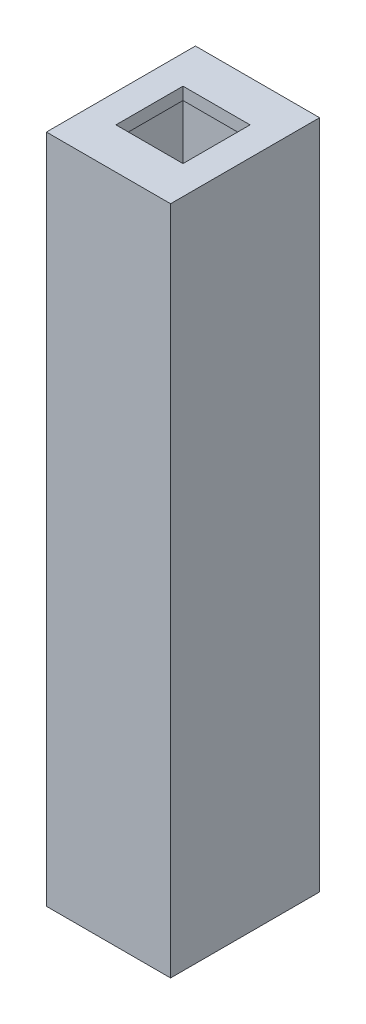
ISO-10303-21;
HEADER;
FILE_DESCRIPTION(('STEP AP214'),'2;1');
FILE_NAME('part.step','',(''),(''),'','','');
FILE_SCHEMA(('AUTOMOTIVE_DESIGN { 1 0 10303 214 1 1 1 1 }'));
ENDSEC;
DATA;
#1=APPLICATION_CONTEXT('core data for automotive mechanical design processes');
#2=APPLICATION_PROTOCOL_DEFINITION('international standard','automotive_design',2000,#1);
#3=PRODUCT_CONTEXT('',#1,'mechanical');
#4=PRODUCT('Part','Part','',(#3));
#5=PRODUCT_RELATED_PRODUCT_CATEGORY('part','',(#4));
#6=PRODUCT_DEFINITION_FORMATION('','',#4);
#7=PRODUCT_DEFINITION_CONTEXT('part definition',#1,'design');
#8=PRODUCT_DEFINITION('design','',#6,#7);
#9=PRODUCT_DEFINITION_SHAPE('','',#8);
#10=(LENGTH_UNIT() NAMED_UNIT(*) SI_UNIT(.MILLI.,.METRE.));
#11=(NAMED_UNIT(*) PLANE_ANGLE_UNIT() SI_UNIT($,.RADIAN.));
#12=(NAMED_UNIT(*) SI_UNIT($,.STERADIAN.) SOLID_ANGLE_UNIT());
#13=UNCERTAINTY_MEASURE_WITH_UNIT(LENGTH_MEASURE(1.E-05),#10,'distance_accuracy_value','');
#14=(GEOMETRIC_REPRESENTATION_CONTEXT(3) GLOBAL_UNCERTAINTY_ASSIGNED_CONTEXT((#13)) GLOBAL_UNIT_ASSIGNED_CONTEXT((#10,
#11,#12)) REPRESENTATION_CONTEXT('',''));
#15=CARTESIAN_POINT('',(0.,0.,0.));
#16=DIRECTION('',(0.,0.,1.));
#17=DIRECTION('',(1.,0.,0.));
#18=AXIS2_PLACEMENT_3D('',#15,#16,#17);
#19=CARTESIAN_POINT('',(0.,54.,-3.1));
#20=DIRECTION('',(0.,0.,-1.));
#21=DIRECTION('',(-1.,0.,0.));
#22=AXIS2_PLACEMENT_3D('',#19,#20,#21);
#23=PLANE('',#22);
#24=DIRECTION('',(0.,-1.,0.));
#25=VECTOR('',#24,1.);
#26=CARTESIAN_POINT('',(3.1,54.,-3.1));
#27=LINE('',#26,#25);
#28=CARTESIAN_POINT('',(3.1,53.,-3.1));
#29=VERTEX_POINT('',#28);
#30=CARTESIAN_POINT('',(3.1,0.,-3.1));
#31=VERTEX_POINT('',#30);
#32=EDGE_CURVE('E72',#29,#31,#27,.T.);
#33=ORIENTED_EDGE('',*,*,#32,.F.);
#34=DIRECTION('',(-1.,0.,0.));
#35=VECTOR('',#34,1.);
#36=CARTESIAN_POINT('',(0.,53.,-3.1));
#37=LINE('',#36,#35);
#38=CARTESIAN_POINT('',(-3.1,53.,-3.1));
#39=VERTEX_POINT('',#38);
#40=EDGE_CURVE('E202',#29,#39,#37,.T.);
#41=ORIENTED_EDGE('',*,*,#40,.T.);
#42=DIRECTION('',(0.,-1.,0.));
#43=VECTOR('',#42,1.);
#44=CARTESIAN_POINT('',(-3.1,54.,-3.1));
#45=LINE('',#44,#43);
#46=CARTESIAN_POINT('',(-3.1,0.,-3.1));
#47=VERTEX_POINT('',#46);
#48=EDGE_CURVE('E240',#39,#47,#45,.T.);
#49=ORIENTED_EDGE('',*,*,#48,.T.);
#50=DIRECTION('',(1.,0.,0.));
#51=VECTOR('',#50,1.);
#52=CARTESIAN_POINT('',(0.,0.,-3.1));
#53=LINE('',#52,#51);
#54=EDGE_CURVE('E229',#47,#31,#53,.T.);
#55=ORIENTED_EDGE('',*,*,#54,.T.);
#56=EDGE_LOOP('',(#33,#41,#49,#55));
#57=FACE_BOUND('',#56,.T.);
#58=ADVANCED_FACE('F64',(#57),#23,.F.);
#59=CARTESIAN_POINT('',(3.1,54.,0.));
#60=DIRECTION('',(1.,0.,0.));
#61=DIRECTION('',(0.,0.,-1.));
#62=AXIS2_PLACEMENT_3D('',#59,#60,#61);
#63=PLANE('',#62);
#64=DIRECTION('',(0.,-1.,0.));
#65=VECTOR('',#64,1.);
#66=CARTESIAN_POINT('',(3.1,54.,3.1));
#67=LINE('',#66,#65);
#68=CARTESIAN_POINT('',(3.1,53.,3.1));
#69=VERTEX_POINT('',#68);
#70=CARTESIAN_POINT('',(3.1,0.,3.1));
#71=VERTEX_POINT('',#70);
#72=EDGE_CURVE('E245',#69,#71,#67,.T.);
#73=ORIENTED_EDGE('',*,*,#72,.F.);
#74=DIRECTION('',(0.,0.,-1.));
#75=VECTOR('',#74,1.);
#76=CARTESIAN_POINT('',(3.1,53.,0.));
#77=LINE('',#76,#75);
#78=EDGE_CURVE('E79',#69,#29,#77,.T.);
#79=ORIENTED_EDGE('',*,*,#78,.T.);
#80=ORIENTED_EDGE('',*,*,#32,.T.);
#81=DIRECTION('',(0.,0.,1.));
#82=VECTOR('',#81,1.);
#83=CARTESIAN_POINT('',(3.1,0.,0.));
#84=LINE('',#83,#82);
#85=EDGE_CURVE('E232',#31,#71,#84,.T.);
#86=ORIENTED_EDGE('',*,*,#85,.T.);
#87=EDGE_LOOP('',(#73,#79,#80,#86));
#88=FACE_BOUND('',#87,.T.);
#89=ADVANCED_FACE('F287',(#88),#63,.F.);
#90=CARTESIAN_POINT('',(0.,54.,3.1));
#91=DIRECTION('',(0.,0.,-1.));
#92=DIRECTION('',(-1.,0.,0.));
#93=AXIS2_PLACEMENT_3D('',#90,#91,#92);
#94=PLANE('',#93);
#95=DIRECTION('',(-1.,0.,0.));
#96=VECTOR('',#95,1.);
#97=CARTESIAN_POINT('',(0.,53.,3.1));
#98=LINE('',#97,#96);
#99=CARTESIAN_POINT('',(-3.1,53.,3.1));
#100=VERTEX_POINT('',#99);
#101=EDGE_CURVE('E87',#69,#100,#98,.T.);
#102=ORIENTED_EDGE('',*,*,#101,.F.);
#103=ORIENTED_EDGE('',*,*,#72,.T.);
#104=DIRECTION('',(1.,0.,0.));
#105=VECTOR('',#104,1.);
#106=CARTESIAN_POINT('',(0.,0.,3.1));
#107=LINE('',#106,#105);
#108=CARTESIAN_POINT('',(-3.1,0.,3.1));
#109=VERTEX_POINT('',#108);
#110=EDGE_CURVE('E235',#109,#71,#107,.T.);
#111=ORIENTED_EDGE('',*,*,#110,.F.);
#112=DIRECTION('',(0.,-1.,0.));
#113=VECTOR('',#112,1.);
#114=CARTESIAN_POINT('',(-3.1,54.,3.1));
#115=LINE('',#114,#113);
#116=EDGE_CURVE('E242',#100,#109,#115,.T.);
#117=ORIENTED_EDGE('',*,*,#116,.F.);
#118=EDGE_LOOP('',(#102,#103,#111,#117));
#119=FACE_BOUND('',#118,.T.);
#120=ADVANCED_FACE('F292',(#119),#94,.T.);
#121=CARTESIAN_POINT('',(5.,54.,0.));
#122=DIRECTION('',(1.,0.,0.));
#123=DIRECTION('',(0.,0.,-1.));
#124=AXIS2_PLACEMENT_3D('',#121,#122,#123);
#125=PLANE('',#124);
#126=DIRECTION('',(0.,0.,1.));
#127=VECTOR('',#126,1.);
#128=CARTESIAN_POINT('',(5.,0.,0.));
#129=LINE('',#128,#127);
#130=CARTESIAN_POINT('',(5.,0.,-6.));
#131=VERTEX_POINT('',#130);
#132=CARTESIAN_POINT('',(5.,0.,6.));
#133=VERTEX_POINT('',#132);
#134=EDGE_CURVE('E205',#131,#133,#129,.T.);
#135=ORIENTED_EDGE('',*,*,#134,.F.);
#136=DIRECTION('',(0.,-1.,0.));
#137=VECTOR('',#136,1.);
#138=CARTESIAN_POINT('',(5.,54.,-6.));
#139=LINE('',#138,#137);
#140=CARTESIAN_POINT('',(5.,54.,-6.));
#141=VERTEX_POINT('',#140);
#142=EDGE_CURVE('E243',#141,#131,#139,.T.);
#143=ORIENTED_EDGE('',*,*,#142,.F.);
#144=DIRECTION('',(0.,0.,1.));
#145=VECTOR('',#144,1.);
#146=CARTESIAN_POINT('',(5.,54.,0.));
#147=LINE('',#146,#145);
#148=CARTESIAN_POINT('',(5.,54.,6.));
#149=VERTEX_POINT('',#148);
#150=EDGE_CURVE('E206',#141,#149,#147,.T.);
#151=ORIENTED_EDGE('',*,*,#150,.T.);
#152=DIRECTION('',(0.,-1.,0.));
#153=VECTOR('',#152,1.);
#154=CARTESIAN_POINT('',(5.,54.,6.));
#155=LINE('',#154,#153);
#156=EDGE_CURVE('E217',#149,#133,#155,.T.);
#157=ORIENTED_EDGE('',*,*,#156,.T.);
#158=EDGE_LOOP('',(#135,#143,#151,#157));
#159=FACE_BOUND('',#158,.T.);
#160=ADVANCED_FACE('F66',(#159),#125,.T.);
#161=CARTESIAN_POINT('',(0.,54.,-6.));
#162=DIRECTION('',(0.,0.,-1.));
#163=DIRECTION('',(-1.,0.,0.));
#164=AXIS2_PLACEMENT_3D('',#161,#162,#163);
#165=PLANE('',#164);
#166=DIRECTION('',(1.,0.,0.));
#167=VECTOR('',#166,1.);
#168=CARTESIAN_POINT('',(0.,0.,-6.));
#169=LINE('',#168,#167);
#170=CARTESIAN_POINT('',(-5.,0.,-6.));
#171=VERTEX_POINT('',#170);
#172=EDGE_CURVE('E220',#171,#131,#169,.T.);
#173=ORIENTED_EDGE('',*,*,#172,.F.);
#174=DIRECTION('',(0.,-1.,0.));
#175=VECTOR('',#174,1.);
#176=CARTESIAN_POINT('',(-5.,54.,-6.));
#177=LINE('',#176,#175);
#178=CARTESIAN_POINT('',(-5.,54.,-6.));
#179=VERTEX_POINT('',#178);
#180=EDGE_CURVE('E251',#179,#171,#177,.T.);
#181=ORIENTED_EDGE('',*,*,#180,.F.);
#182=DIRECTION('',(1.,0.,0.));
#183=VECTOR('',#182,1.);
#184=CARTESIAN_POINT('',(0.,54.,-6.));
#185=LINE('',#184,#183);
#186=EDGE_CURVE('E209',#179,#141,#185,.T.);
#187=ORIENTED_EDGE('',*,*,#186,.T.);
#188=ORIENTED_EDGE('',*,*,#142,.T.);
#189=EDGE_LOOP('',(#173,#181,#187,#188));
#190=FACE_BOUND('',#189,.T.);
#191=ADVANCED_FACE('F255',(#190),#165,.T.);
#192=CARTESIAN_POINT('',(-5.,54.,0.));
#193=DIRECTION('',(1.,0.,0.));
#194=DIRECTION('',(0.,0.,-1.));
#195=AXIS2_PLACEMENT_3D('',#192,#193,#194);
#196=PLANE('',#195);
#197=DIRECTION('',(0.,0.,1.));
#198=VECTOR('',#197,1.);
#199=CARTESIAN_POINT('',(-5.,0.,0.));
#200=LINE('',#199,#198);
#201=CARTESIAN_POINT('',(-5.,0.,6.));
#202=VERTEX_POINT('',#201);
#203=EDGE_CURVE('E223',#171,#202,#200,.T.);
#204=ORIENTED_EDGE('',*,*,#203,.T.);
#205=DIRECTION('',(0.,-1.,0.));
#206=VECTOR('',#205,1.);
#207=CARTESIAN_POINT('',(-5.,54.,6.));
#208=LINE('',#207,#206);
#209=CARTESIAN_POINT('',(-5.,54.,6.));
#210=VERTEX_POINT('',#209);
#211=EDGE_CURVE('E249',#210,#202,#208,.T.);
#212=ORIENTED_EDGE('',*,*,#211,.F.);
#213=DIRECTION('',(0.,0.,1.));
#214=VECTOR('',#213,1.);
#215=CARTESIAN_POINT('',(-5.,54.,0.));
#216=LINE('',#215,#214);
#217=EDGE_CURVE('E213',#179,#210,#216,.T.);
#218=ORIENTED_EDGE('',*,*,#217,.F.);
#219=ORIENTED_EDGE('',*,*,#180,.T.);
#220=EDGE_LOOP('',(#204,#212,#218,#219));
#221=FACE_BOUND('',#220,.T.);
#222=ADVANCED_FACE('F267',(#221),#196,.F.);
#223=CARTESIAN_POINT('',(0.,54.,6.));
#224=DIRECTION('',(0.,0.,-1.));
#225=DIRECTION('',(-1.,0.,0.));
#226=AXIS2_PLACEMENT_3D('',#223,#224,#225);
#227=PLANE('',#226);
#228=DIRECTION('',(1.,0.,0.));
#229=VECTOR('',#228,1.);
#230=CARTESIAN_POINT('',(0.,0.,6.));
#231=LINE('',#230,#229);
#232=EDGE_CURVE('E226',#202,#133,#231,.T.);
#233=ORIENTED_EDGE('',*,*,#232,.T.);
#234=ORIENTED_EDGE('',*,*,#156,.F.);
#235=DIRECTION('',(1.,0.,0.));
#236=VECTOR('',#235,1.);
#237=CARTESIAN_POINT('',(0.,54.,6.));
#238=LINE('',#237,#236);
#239=EDGE_CURVE('E215',#210,#149,#238,.T.);
#240=ORIENTED_EDGE('',*,*,#239,.F.);
#241=ORIENTED_EDGE('',*,*,#211,.T.);
#242=EDGE_LOOP('',(#233,#234,#240,#241));
#243=FACE_BOUND('',#242,.T.);
#244=ADVANCED_FACE('F274',(#243),#227,.F.);
#245=CARTESIAN_POINT('',(-3.1,54.,0.));
#246=DIRECTION('',(1.,0.,0.));
#247=DIRECTION('',(0.,0.,-1.));
#248=AXIS2_PLACEMENT_3D('',#245,#246,#247);
#249=PLANE('',#248);
#250=DIRECTION('',(0.,0.,-1.));
#251=VECTOR('',#250,1.);
#252=CARTESIAN_POINT('',(-3.1,53.,0.));
#253=LINE('',#252,#251);
#254=EDGE_CURVE('E12',#100,#39,#253,.T.);
#255=ORIENTED_EDGE('',*,*,#254,.F.);
#256=ORIENTED_EDGE('',*,*,#116,.T.);
#257=DIRECTION('',(0.,0.,1.));
#258=VECTOR('',#257,1.);
#259=CARTESIAN_POINT('',(-3.1,0.,0.));
#260=LINE('',#259,#258);
#261=EDGE_CURVE('E210',#47,#109,#260,.T.);
#262=ORIENTED_EDGE('',*,*,#261,.F.);
#263=ORIENTED_EDGE('',*,*,#48,.F.);
#264=EDGE_LOOP('',(#255,#256,#262,#263));
#265=FACE_BOUND('',#264,.T.);
#266=ADVANCED_FACE('F276',(#265),#249,.T.);
#267=CARTESIAN_POINT('',(0.,54.,0.));
#268=DIRECTION('',(0.,1.,0.));
#269=DIRECTION('',(0.,0.,1.));
#270=AXIS2_PLACEMENT_3D('',#267,#268,#269);
#271=PLANE('',#270);
#272=ORIENTED_EDGE('',*,*,#150,.F.);
#273=ORIENTED_EDGE('',*,*,#186,.F.);
#274=ORIENTED_EDGE('',*,*,#217,.T.);
#275=ORIENTED_EDGE('',*,*,#239,.T.);
#276=EDGE_LOOP('',(#272,#273,#274,#275));
#277=FACE_BOUND('',#276,.T.);
#278=DIRECTION('',(0.,0.,1.));
#279=VECTOR('',#278,1.);
#280=CARTESIAN_POINT('',(-2.7,54.,0.));
#281=LINE('',#280,#279);
#282=CARTESIAN_POINT('',(-2.7,54.,-2.7));
#283=VERTEX_POINT('',#282);
#284=CARTESIAN_POINT('',(-2.7,54.,2.7));
#285=VERTEX_POINT('',#284);
#286=EDGE_CURVE('E190',#283,#285,#281,.T.);
#287=ORIENTED_EDGE('',*,*,#286,.F.);
#288=DIRECTION('',(-1.,0.,0.));
#289=VECTOR('',#288,1.);
#290=CARTESIAN_POINT('',(0.,54.,-2.7));
#291=LINE('',#290,#289);
#292=CARTESIAN_POINT('',(2.7,54.,-2.7));
#293=VERTEX_POINT('',#292);
#294=EDGE_CURVE('E161',#293,#283,#291,.T.);
#295=ORIENTED_EDGE('',*,*,#294,.F.);
#296=DIRECTION('',(0.,0.,1.));
#297=VECTOR('',#296,1.);
#298=CARTESIAN_POINT('',(2.7,54.,0.));
#299=LINE('',#298,#297);
#300=CARTESIAN_POINT('',(2.7,54.,2.7));
#301=VERTEX_POINT('',#300);
#302=EDGE_CURVE('E178',#293,#301,#299,.T.);
#303=ORIENTED_EDGE('',*,*,#302,.T.);
#304=DIRECTION('',(-1.,0.,0.));
#305=VECTOR('',#304,1.);
#306=CARTESIAN_POINT('',(0.,54.,2.7));
#307=LINE('',#306,#305);
#308=EDGE_CURVE('E181',#301,#285,#307,.T.);
#309=ORIENTED_EDGE('',*,*,#308,.T.);
#310=EDGE_LOOP('',(#287,#295,#303,#309));
#311=FACE_BOUND('',#310,.T.);
#312=ADVANCED_FACE('F271',(#277,#311),#271,.T.);
#313=CARTESIAN_POINT('',(0.,0.,0.));
#314=DIRECTION('',(0.,1.,0.));
#315=DIRECTION('',(0.,0.,1.));
#316=AXIS2_PLACEMENT_3D('',#313,#314,#315);
#317=PLANE('',#316);
#318=CARTESIAN_POINT('',(3.74999999999999,0.,4.5));
#319=DIRECTION('',(0.,-1.,0.));
#320=DIRECTION('',(0.,0.,-1.));
#321=AXIS2_PLACEMENT_3D('',#318,#319,#320);
#322=CIRCLE('',#321,0.3);
#323=CARTESIAN_POINT('',(3.74999999999999,0.,4.2));
#324=VERTEX_POINT('',#323);
#325=EDGE_CURVE('E364',#324,#324,#322,.T.);
#326=ORIENTED_EDGE('',*,*,#325,.F.);
#327=EDGE_LOOP('',(#326));
#328=FACE_BOUND('',#327,.T.);
#329=CARTESIAN_POINT('',(-3.75,0.,-4.5));
#330=DIRECTION('',(0.,-1.,0.));
#331=DIRECTION('',(0.,0.,-1.));
#332=AXIS2_PLACEMENT_3D('',#329,#330,#331);
#333=CIRCLE('',#332,0.3);
#334=CARTESIAN_POINT('',(-3.75,0.,-4.8));
#335=VERTEX_POINT('',#334);
#336=EDGE_CURVE('E360',#335,#335,#333,.T.);
#337=ORIENTED_EDGE('',*,*,#336,.F.);
#338=EDGE_LOOP('',(#337));
#339=FACE_BOUND('',#338,.T.);
#340=CARTESIAN_POINT('',(3.74999999999999,0.,-4.5));
#341=DIRECTION('',(0.,-1.,0.));
#342=DIRECTION('',(0.,0.,-1.));
#343=AXIS2_PLACEMENT_3D('',#340,#341,#342);
#344=CIRCLE('',#343,0.3);
#345=CARTESIAN_POINT('',(3.74999999999999,0.,-4.8));
#346=VERTEX_POINT('',#345);
#347=EDGE_CURVE('E355',#346,#346,#344,.T.);
#348=ORIENTED_EDGE('',*,*,#347,.F.);
#349=EDGE_LOOP('',(#348));
#350=FACE_BOUND('',#349,.T.);
#351=CARTESIAN_POINT('',(-3.75,0.,4.5));
#352=DIRECTION('',(0.,-1.,0.));
#353=DIRECTION('',(0.,0.,-1.));
#354=AXIS2_PLACEMENT_3D('',#351,#352,#353);
#355=CIRCLE('',#354,0.3);
#356=CARTESIAN_POINT('',(-3.75,0.,4.2));
#357=VERTEX_POINT('',#356);
#358=EDGE_CURVE('E184',#357,#357,#355,.T.);
#359=ORIENTED_EDGE('',*,*,#358,.F.);
#360=EDGE_LOOP('',(#359));
#361=FACE_BOUND('',#360,.T.);
#362=ORIENTED_EDGE('',*,*,#134,.T.);
#363=ORIENTED_EDGE('',*,*,#232,.F.);
#364=ORIENTED_EDGE('',*,*,#203,.F.);
#365=ORIENTED_EDGE('',*,*,#172,.T.);
#366=EDGE_LOOP('',(#362,#363,#364,#365));
#367=FACE_BOUND('',#366,.T.);
#368=ORIENTED_EDGE('',*,*,#54,.F.);
#369=ORIENTED_EDGE('',*,*,#261,.T.);
#370=ORIENTED_EDGE('',*,*,#110,.T.);
#371=ORIENTED_EDGE('',*,*,#85,.F.);
#372=EDGE_LOOP('',(#368,#369,#370,#371));
#373=FACE_BOUND('',#372,.T.);
#374=ADVANCED_FACE('F263',(#328,#339,#350,#361,#367,#373),#317,.F.);
#375=CARTESIAN_POINT('',(0.,53.,0.));
#376=DIRECTION('',(0.,-1.,0.));
#377=DIRECTION('',(0.,0.,-1.));
#378=AXIS2_PLACEMENT_3D('',#375,#376,#377);
#379=PLANE('',#378);
#380=DIRECTION('',(-1.,0.,0.));
#381=VECTOR('',#380,1.);
#382=CARTESIAN_POINT('',(0.,53.,-2.7));
#383=LINE('',#382,#381);
#384=CARTESIAN_POINT('',(2.7,53.,-2.7));
#385=VERTEX_POINT('',#384);
#386=CARTESIAN_POINT('',(-2.7,53.,-2.7));
#387=VERTEX_POINT('',#386);
#388=EDGE_CURVE('E158',#385,#387,#383,.T.);
#389=ORIENTED_EDGE('',*,*,#388,.T.);
#390=DIRECTION('',(0.,0.,1.));
#391=VECTOR('',#390,1.);
#392=CARTESIAN_POINT('',(-2.7,53.,0.));
#393=LINE('',#392,#391);
#394=CARTESIAN_POINT('',(-2.7,53.,2.7));
#395=VERTEX_POINT('',#394);
#396=EDGE_CURVE('E169',#387,#395,#393,.T.);
#397=ORIENTED_EDGE('',*,*,#396,.T.);
#398=DIRECTION('',(-1.,0.,0.));
#399=VECTOR('',#398,1.);
#400=CARTESIAN_POINT('',(0.,53.,2.7));
#401=LINE('',#400,#399);
#402=CARTESIAN_POINT('',(2.7,53.,2.7));
#403=VERTEX_POINT('',#402);
#404=EDGE_CURVE('E174',#403,#395,#401,.T.);
#405=ORIENTED_EDGE('',*,*,#404,.F.);
#406=DIRECTION('',(0.,0.,1.));
#407=VECTOR('',#406,1.);
#408=CARTESIAN_POINT('',(2.7,53.,0.));
#409=LINE('',#408,#407);
#410=EDGE_CURVE('E166',#385,#403,#409,.T.);
#411=ORIENTED_EDGE('',*,*,#410,.F.);
#412=EDGE_LOOP('',(#389,#397,#405,#411));
#413=FACE_BOUND('',#412,.T.);
#414=ORIENTED_EDGE('',*,*,#40,.F.);
#415=ORIENTED_EDGE('',*,*,#78,.F.);
#416=ORIENTED_EDGE('',*,*,#101,.T.);
#417=ORIENTED_EDGE('',*,*,#254,.T.);
#418=EDGE_LOOP('',(#414,#415,#416,#417));
#419=FACE_BOUND('',#418,.T.);
#420=ADVANCED_FACE('F176',(#413,#419),#379,.T.);
#421=CARTESIAN_POINT('',(0.,53.,-2.7));
#422=DIRECTION('',(0.,0.,-1.));
#423=DIRECTION('',(-1.,0.,0.));
#424=AXIS2_PLACEMENT_3D('',#421,#422,#423);
#425=PLANE('',#424);
#426=ORIENTED_EDGE('',*,*,#294,.T.);
#427=DIRECTION('',(0.,1.,0.));
#428=VECTOR('',#427,1.);
#429=CARTESIAN_POINT('',(-2.7,53.,-2.7));
#430=LINE('',#429,#428);
#431=EDGE_CURVE('E154',#387,#283,#430,.T.);
#432=ORIENTED_EDGE('',*,*,#431,.F.);
#433=ORIENTED_EDGE('',*,*,#388,.F.);
#434=DIRECTION('',(0.,1.,0.));
#435=VECTOR('',#434,1.);
#436=CARTESIAN_POINT('',(2.7,53.,-2.7));
#437=LINE('',#436,#435);
#438=EDGE_CURVE('E195',#385,#293,#437,.T.);
#439=ORIENTED_EDGE('',*,*,#438,.T.);
#440=EDGE_LOOP('',(#426,#432,#433,#439));
#441=FACE_BOUND('',#440,.T.);
#442=ADVANCED_FACE('F156',(#441),#425,.F.);
#443=CARTESIAN_POINT('',(2.7,53.,0.));
#444=DIRECTION('',(-1.,0.,0.));
#445=DIRECTION('',(0.,0.,1.));
#446=AXIS2_PLACEMENT_3D('',#443,#444,#445);
#447=PLANE('',#446);
#448=ORIENTED_EDGE('',*,*,#302,.F.);
#449=ORIENTED_EDGE('',*,*,#438,.F.);
#450=ORIENTED_EDGE('',*,*,#410,.T.);
#451=DIRECTION('',(0.,1.,0.));
#452=VECTOR('',#451,1.);
#453=CARTESIAN_POINT('',(2.7,53.,2.7));
#454=LINE('',#453,#452);
#455=EDGE_CURVE('E197',#403,#301,#454,.T.);
#456=ORIENTED_EDGE('',*,*,#455,.T.);
#457=EDGE_LOOP('',(#448,#449,#450,#456));
#458=FACE_BOUND('',#457,.T.);
#459=ADVANCED_FACE('F306',(#458),#447,.T.);
#460=CARTESIAN_POINT('',(0.,53.,2.7));
#461=DIRECTION('',(0.,0.,-1.));
#462=DIRECTION('',(-1.,0.,0.));
#463=AXIS2_PLACEMENT_3D('',#460,#461,#462);
#464=PLANE('',#463);
#465=ORIENTED_EDGE('',*,*,#308,.F.);
#466=ORIENTED_EDGE('',*,*,#455,.F.);
#467=ORIENTED_EDGE('',*,*,#404,.T.);
#468=DIRECTION('',(0.,1.,0.));
#469=VECTOR('',#468,1.);
#470=CARTESIAN_POINT('',(-2.7,53.,2.7));
#471=LINE('',#470,#469);
#472=EDGE_CURVE('E165',#395,#285,#471,.T.);
#473=ORIENTED_EDGE('',*,*,#472,.T.);
#474=EDGE_LOOP('',(#465,#466,#467,#473));
#475=FACE_BOUND('',#474,.T.);
#476=ADVANCED_FACE('F310',(#475),#464,.T.);
#477=CARTESIAN_POINT('',(-2.7,53.,0.));
#478=DIRECTION('',(-1.,0.,0.));
#479=DIRECTION('',(0.,0.,1.));
#480=AXIS2_PLACEMENT_3D('',#477,#478,#479);
#481=PLANE('',#480);
#482=ORIENTED_EDGE('',*,*,#286,.T.);
#483=ORIENTED_EDGE('',*,*,#472,.F.);
#484=ORIENTED_EDGE('',*,*,#396,.F.);
#485=ORIENTED_EDGE('',*,*,#431,.T.);
#486=EDGE_LOOP('',(#482,#483,#484,#485));
#487=FACE_BOUND('',#486,.T.);
#488=ADVANCED_FACE('F170',(#487),#481,.F.);
#489=CARTESIAN_POINT('',(-3.75,2.,4.5));
#490=DIRECTION('',(0.,-1.,0.));
#491=DIRECTION('',(0.,0.,-1.));
#492=AXIS2_PLACEMENT_3D('',#489,#490,#491);
#493=CYLINDRICAL_SURFACE('',#492,0.3);
#494=CARTESIAN_POINT('',(-3.75,2.,4.5));
#495=DIRECTION('',(0.,-1.,0.));
#496=DIRECTION('',(0.,0.,-1.));
#497=AXIS2_PLACEMENT_3D('',#494,#495,#496);
#498=CIRCLE('',#497,0.3);
#499=CARTESIAN_POINT('',(-3.75,2.,4.2));
#500=VERTEX_POINT('',#499);
#501=EDGE_CURVE('E191',#500,#500,#498,.T.);
#502=ORIENTED_EDGE('',*,*,#501,.F.);
#503=EDGE_LOOP('',(#502));
#504=FACE_BOUND('',#503,.T.);
#505=ORIENTED_EDGE('',*,*,#358,.T.);
#506=EDGE_LOOP('',(#505));
#507=FACE_BOUND('',#506,.T.);
#508=ADVANCED_FACE('F309',(#504,#507),#493,.F.);
#509=CARTESIAN_POINT('',(-3.75,2.,4.5));
#510=DIRECTION('',(0.,-1.,0.));
#511=DIRECTION('',(0.,0.,-1.));
#512=AXIS2_PLACEMENT_3D('',#509,#510,#511);
#513=PLANE('',#512);
#514=ORIENTED_EDGE('',*,*,#501,.T.);
#515=EDGE_LOOP('',(#514));
#516=FACE_BOUND('',#515,.T.);
#517=ADVANCED_FACE('F319',(#516),#513,.T.);
#518=CARTESIAN_POINT('',(3.74999999999999,2.,-4.5));
#519=DIRECTION('',(0.,-1.,0.));
#520=DIRECTION('',(0.,0.,-1.));
#521=AXIS2_PLACEMENT_3D('',#518,#519,#520);
#522=CYLINDRICAL_SURFACE('',#521,0.3);
#523=CARTESIAN_POINT('',(3.74999999999999,2.,-4.5));
#524=DIRECTION('',(0.,-1.,0.));
#525=DIRECTION('',(0.,0.,-1.));
#526=AXIS2_PLACEMENT_3D('',#523,#524,#525);
#527=CIRCLE('',#526,0.3);
#528=CARTESIAN_POINT('',(3.74999999999999,2.,-4.8));
#529=VERTEX_POINT('',#528);
#530=EDGE_CURVE('E352',#529,#529,#527,.T.);
#531=ORIENTED_EDGE('',*,*,#530,.F.);
#532=EDGE_LOOP('',(#531));
#533=FACE_BOUND('',#532,.T.);
#534=ORIENTED_EDGE('',*,*,#347,.T.);
#535=EDGE_LOOP('',(#534));
#536=FACE_BOUND('',#535,.T.);
#537=ADVANCED_FACE('F323',(#533,#536),#522,.F.);
#538=CARTESIAN_POINT('',(3.74999999999999,2.,-4.5));
#539=DIRECTION('',(0.,-1.,0.));
#540=DIRECTION('',(0.,0.,-1.));
#541=AXIS2_PLACEMENT_3D('',#538,#539,#540);
#542=PLANE('',#541);
#543=ORIENTED_EDGE('',*,*,#530,.T.);
#544=EDGE_LOOP('',(#543));
#545=FACE_BOUND('',#544,.T.);
#546=ADVANCED_FACE('F333',(#545),#542,.T.);
#547=CARTESIAN_POINT('',(-3.75,2.,-4.5));
#548=DIRECTION('',(0.,-1.,0.));
#549=DIRECTION('',(0.,0.,-1.));
#550=AXIS2_PLACEMENT_3D('',#547,#548,#549);
#551=CYLINDRICAL_SURFACE('',#550,0.3);
#552=CARTESIAN_POINT('',(-3.75,2.,-4.5));
#553=DIRECTION('',(0.,-1.,0.));
#554=DIRECTION('',(0.,0.,-1.));
#555=AXIS2_PLACEMENT_3D('',#552,#553,#554);
#556=CIRCLE('',#555,0.3);
#557=CARTESIAN_POINT('',(-3.75,2.,-4.8));
#558=VERTEX_POINT('',#557);
#559=EDGE_CURVE('E357',#558,#558,#556,.T.);
#560=ORIENTED_EDGE('',*,*,#559,.F.);
#561=EDGE_LOOP('',(#560));
#562=FACE_BOUND('',#561,.T.);
#563=ORIENTED_EDGE('',*,*,#336,.T.);
#564=EDGE_LOOP('',(#563));
#565=FACE_BOUND('',#564,.T.);
#566=ADVANCED_FACE('F329',(#562,#565),#551,.F.);
#567=CARTESIAN_POINT('',(-3.75,2.,-4.5));
#568=DIRECTION('',(0.,-1.,0.));
#569=DIRECTION('',(0.,0.,-1.));
#570=AXIS2_PLACEMENT_3D('',#567,#568,#569);
#571=PLANE('',#570);
#572=ORIENTED_EDGE('',*,*,#559,.T.);
#573=EDGE_LOOP('',(#572));
#574=FACE_BOUND('',#573,.T.);
#575=ADVANCED_FACE('F325',(#574),#571,.T.);
#576=CARTESIAN_POINT('',(3.74999999999999,2.,4.5));
#577=DIRECTION('',(0.,-1.,0.));
#578=DIRECTION('',(0.,0.,-1.));
#579=AXIS2_PLACEMENT_3D('',#576,#577,#578);
#580=CYLINDRICAL_SURFACE('',#579,0.3);
#581=CARTESIAN_POINT('',(3.74999999999999,2.,4.5));
#582=DIRECTION('',(0.,-1.,0.));
#583=DIRECTION('',(0.,0.,-1.));
#584=AXIS2_PLACEMENT_3D('',#581,#582,#583);
#585=CIRCLE('',#584,0.3);
#586=CARTESIAN_POINT('',(3.74999999999999,2.,4.2));
#587=VERTEX_POINT('',#586);
#588=EDGE_CURVE('E367',#587,#587,#585,.T.);
#589=ORIENTED_EDGE('',*,*,#588,.F.);
#590=EDGE_LOOP('',(#589));
#591=FACE_BOUND('',#590,.T.);
#592=ORIENTED_EDGE('',*,*,#325,.T.);
#593=EDGE_LOOP('',(#592));
#594=FACE_BOUND('',#593,.T.);
#595=ADVANCED_FACE('F328',(#591,#594),#580,.F.);
#596=CARTESIAN_POINT('',(3.74999999999999,2.,4.5));
#597=DIRECTION('',(0.,-1.,0.));
#598=DIRECTION('',(0.,0.,-1.));
#599=AXIS2_PLACEMENT_3D('',#596,#597,#598);
#600=PLANE('',#599);
#601=ORIENTED_EDGE('',*,*,#588,.T.);
#602=EDGE_LOOP('',(#601));
#603=FACE_BOUND('',#602,.T.);
#604=ADVANCED_FACE('F335',(#603),#600,.T.);
#605=CLOSED_SHELL('',(#58,#89,#120,#160,#191,#222,#244,#266,#312,#374,#420,#442,#459,#476,#488,
#508,#517,#537,#546,#566,#575,#595,#604));
#606=MANIFOLD_SOLID_BREP('B2',#605);
#607=ADVANCED_BREP_SHAPE_REPRESENTATION('',(#18,#606),#14);
#608=SHAPE_DEFINITION_REPRESENTATION(#9,#607);
ENDSEC;
END-ISO-10303-21;
